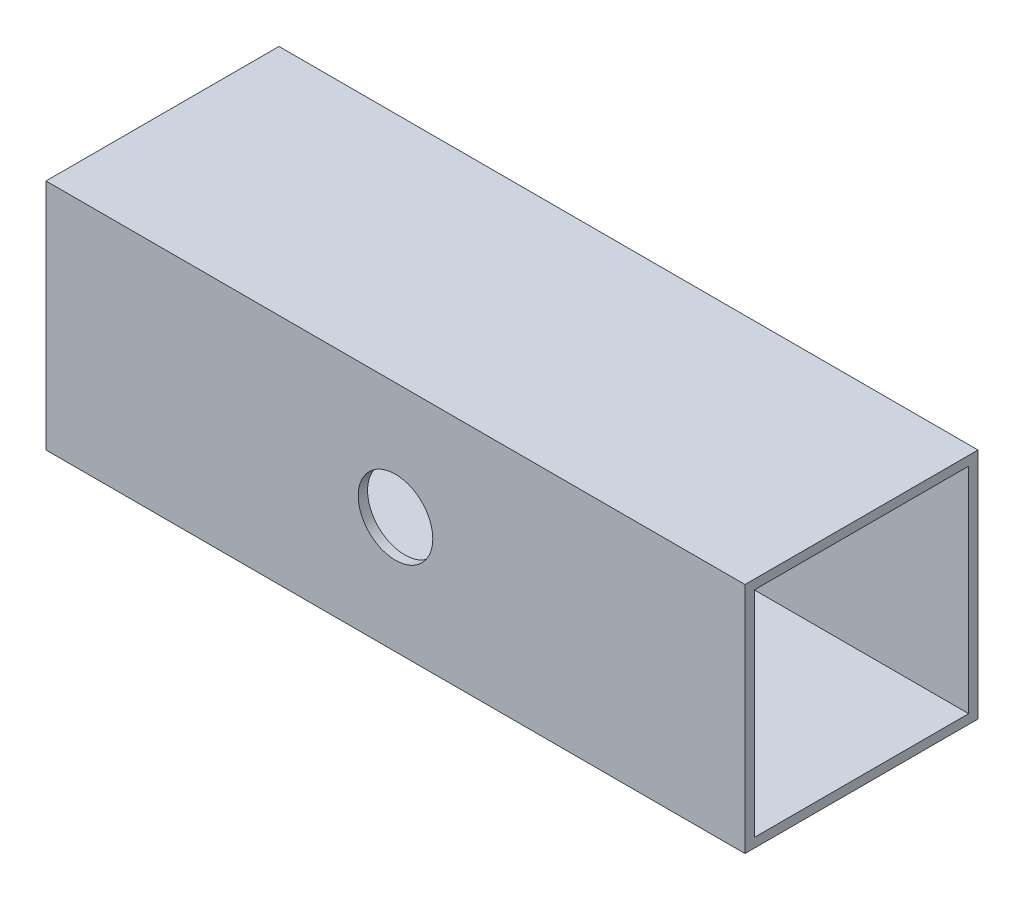
ISO-10303-21;
HEADER;
FILE_DESCRIPTION(('STEP AP214'),'2;1');
FILE_NAME('part.step','',(''),(''),'','','');
FILE_SCHEMA(('AUTOMOTIVE_DESIGN { 1 0 10303 214 1 1 1 1 }'));
ENDSEC;
DATA;
#1=APPLICATION_CONTEXT('core data for automotive mechanical design processes');
#2=APPLICATION_PROTOCOL_DEFINITION('international standard','automotive_design',2000,#1);
#3=PRODUCT_CONTEXT('',#1,'mechanical');
#4=PRODUCT('Part','Part','',(#3));
#5=PRODUCT_RELATED_PRODUCT_CATEGORY('part','',(#4));
#6=PRODUCT_DEFINITION_FORMATION('','',#4);
#7=PRODUCT_DEFINITION_CONTEXT('part definition',#1,'design');
#8=PRODUCT_DEFINITION('design','',#6,#7);
#9=PRODUCT_DEFINITION_SHAPE('','',#8);
#10=(LENGTH_UNIT() NAMED_UNIT(*) SI_UNIT(.MILLI.,.METRE.));
#11=(NAMED_UNIT(*) PLANE_ANGLE_UNIT() SI_UNIT($,.RADIAN.));
#12=(NAMED_UNIT(*) SI_UNIT($,.STERADIAN.) SOLID_ANGLE_UNIT());
#13=UNCERTAINTY_MEASURE_WITH_UNIT(LENGTH_MEASURE(1.E-05),#10,'distance_accuracy_value','');
#14=(GEOMETRIC_REPRESENTATION_CONTEXT(3) GLOBAL_UNCERTAINTY_ASSIGNED_CONTEXT((#13)) GLOBAL_UNIT_ASSIGNED_CONTEXT((#10,
#11,#12)) REPRESENTATION_CONTEXT('',''));
#15=CARTESIAN_POINT('',(0.,0.,0.));
#16=DIRECTION('',(0.,0.,1.));
#17=DIRECTION('',(1.,0.,0.));
#18=AXIS2_PLACEMENT_3D('',#15,#16,#17);
#19=CARTESIAN_POINT('',(75.,0.,0.));
#20=DIRECTION('',(-1.,0.,0.));
#21=DIRECTION('',(0.,0.,1.));
#22=AXIS2_PLACEMENT_3D('',#19,#20,#21);
#23=PLANE('',#22);
#24=DIRECTION('',(0.,1.,0.));
#25=VECTOR('',#24,1.);
#26=CARTESIAN_POINT('',(75.,-12.5,-12.5));
#27=LINE('',#26,#25);
#28=CARTESIAN_POINT('',(75.,-12.5,-12.5));
#29=VERTEX_POINT('',#28);
#30=CARTESIAN_POINT('',(75.,12.5,-12.5));
#31=VERTEX_POINT('',#30);
#32=EDGE_CURVE('E141',#29,#31,#27,.T.);
#33=ORIENTED_EDGE('',*,*,#32,.T.);
#34=DIRECTION('',(0.,0.,1.));
#35=VECTOR('',#34,1.);
#36=CARTESIAN_POINT('',(75.,12.5,12.5));
#37=LINE('',#36,#35);
#38=CARTESIAN_POINT('',(75.,12.5,12.5));
#39=VERTEX_POINT('',#38);
#40=EDGE_CURVE('E144',#31,#39,#37,.T.);
#41=ORIENTED_EDGE('',*,*,#40,.T.);
#42=DIRECTION('',(0.,-1.,0.));
#43=VECTOR('',#42,1.);
#44=CARTESIAN_POINT('',(75.,-12.5,12.5));
#45=LINE('',#44,#43);
#46=CARTESIAN_POINT('',(75.,-12.5,12.5));
#47=VERTEX_POINT('',#46);
#48=EDGE_CURVE('E147',#39,#47,#45,.T.);
#49=ORIENTED_EDGE('',*,*,#48,.T.);
#50=DIRECTION('',(0.,0.,-1.));
#51=VECTOR('',#50,1.);
#52=CARTESIAN_POINT('',(75.,-12.5,12.5));
#53=LINE('',#52,#51);
#54=EDGE_CURVE('E149',#47,#29,#53,.T.);
#55=ORIENTED_EDGE('',*,*,#54,.T.);
#56=EDGE_LOOP('',(#33,#41,#49,#55));
#57=FACE_BOUND('',#56,.T.);
#58=DIRECTION('',(0.,-1.,0.));
#59=VECTOR('',#58,1.);
#60=CARTESIAN_POINT('',(75.,-11.5,11.5));
#61=LINE('',#60,#59);
#62=CARTESIAN_POINT('',(75.,11.5,11.5));
#63=VERTEX_POINT('',#62);
#64=CARTESIAN_POINT('',(75.,-11.5,11.5));
#65=VERTEX_POINT('',#64);
#66=EDGE_CURVE('E103',#63,#65,#61,.T.);
#67=ORIENTED_EDGE('',*,*,#66,.F.);
#68=DIRECTION('',(0.,0.,1.));
#69=VECTOR('',#68,1.);
#70=CARTESIAN_POINT('',(75.,11.5,11.5));
#71=LINE('',#70,#69);
#72=CARTESIAN_POINT('',(75.,11.5,-11.5));
#73=VERTEX_POINT('',#72);
#74=EDGE_CURVE('E125',#73,#63,#71,.T.);
#75=ORIENTED_EDGE('',*,*,#74,.F.);
#76=DIRECTION('',(0.,1.,0.));
#77=VECTOR('',#76,1.);
#78=CARTESIAN_POINT('',(75.,-11.5,-11.5));
#79=LINE('',#78,#77);
#80=CARTESIAN_POINT('',(75.,-11.5,-11.5));
#81=VERTEX_POINT('',#80);
#82=EDGE_CURVE('E123',#81,#73,#79,.T.);
#83=ORIENTED_EDGE('',*,*,#82,.F.);
#84=DIRECTION('',(0.,0.,-1.));
#85=VECTOR('',#84,1.);
#86=CARTESIAN_POINT('',(75.,-11.5,11.5));
#87=LINE('',#86,#85);
#88=EDGE_CURVE('E111',#65,#81,#87,.T.);
#89=ORIENTED_EDGE('',*,*,#88,.F.);
#90=EDGE_LOOP('',(#67,#75,#83,#89));
#91=FACE_BOUND('',#90,.T.);
#92=ADVANCED_FACE('F37',(#57,#91),#23,.F.);
#93=CARTESIAN_POINT('',(0.,0.,0.));
#94=DIRECTION('',(-1.,0.,0.));
#95=DIRECTION('',(0.,0.,1.));
#96=AXIS2_PLACEMENT_3D('',#93,#94,#95);
#97=PLANE('',#96);
#98=DIRECTION('',(0.,1.,0.));
#99=VECTOR('',#98,1.);
#100=CARTESIAN_POINT('',(0.,-12.5,-12.5));
#101=LINE('',#100,#99);
#102=CARTESIAN_POINT('',(0.,-12.5,-12.5));
#103=VERTEX_POINT('',#102);
#104=CARTESIAN_POINT('',(0.,12.5,-12.5));
#105=VERTEX_POINT('',#104);
#106=EDGE_CURVE('E119',#103,#105,#101,.T.);
#107=ORIENTED_EDGE('',*,*,#106,.F.);
#108=DIRECTION('',(0.,0.,-1.));
#109=VECTOR('',#108,1.);
#110=CARTESIAN_POINT('',(0.,-12.5,12.5));
#111=LINE('',#110,#109);
#112=CARTESIAN_POINT('',(0.,-12.5,12.5));
#113=VERTEX_POINT('',#112);
#114=EDGE_CURVE('E145',#113,#103,#111,.T.);
#115=ORIENTED_EDGE('',*,*,#114,.F.);
#116=DIRECTION('',(0.,-1.,0.));
#117=VECTOR('',#116,1.);
#118=CARTESIAN_POINT('',(0.,-12.5,12.5));
#119=LINE('',#118,#117);
#120=CARTESIAN_POINT('',(0.,12.5,12.5));
#121=VERTEX_POINT('',#120);
#122=EDGE_CURVE('E156',#121,#113,#119,.T.);
#123=ORIENTED_EDGE('',*,*,#122,.F.);
#124=DIRECTION('',(0.,0.,1.));
#125=VECTOR('',#124,1.);
#126=CARTESIAN_POINT('',(0.,12.5,12.5));
#127=LINE('',#126,#125);
#128=EDGE_CURVE('E154',#105,#121,#127,.T.);
#129=ORIENTED_EDGE('',*,*,#128,.F.);
#130=EDGE_LOOP('',(#107,#115,#123,#129));
#131=FACE_BOUND('',#130,.T.);
#132=DIRECTION('',(0.,0.,1.));
#133=VECTOR('',#132,1.);
#134=CARTESIAN_POINT('',(0.,11.5,11.5));
#135=LINE('',#134,#133);
#136=CARTESIAN_POINT('',(0.,11.5,-11.5));
#137=VERTEX_POINT('',#136);
#138=CARTESIAN_POINT('',(0.,11.5,11.5));
#139=VERTEX_POINT('',#138);
#140=EDGE_CURVE('E112',#137,#139,#135,.T.);
#141=ORIENTED_EDGE('',*,*,#140,.T.);
#142=DIRECTION('',(0.,-1.,0.));
#143=VECTOR('',#142,1.);
#144=CARTESIAN_POINT('',(0.,-11.5,11.5));
#145=LINE('',#144,#143);
#146=CARTESIAN_POINT('',(0.,-11.5,11.5));
#147=VERTEX_POINT('',#146);
#148=EDGE_CURVE('E61',#139,#147,#145,.T.);
#149=ORIENTED_EDGE('',*,*,#148,.T.);
#150=DIRECTION('',(0.,0.,-1.));
#151=VECTOR('',#150,1.);
#152=CARTESIAN_POINT('',(0.,-11.5,11.5));
#153=LINE('',#152,#151);
#154=CARTESIAN_POINT('',(0.,-11.5,-11.5));
#155=VERTEX_POINT('',#154);
#156=EDGE_CURVE('E118',#147,#155,#153,.T.);
#157=ORIENTED_EDGE('',*,*,#156,.T.);
#158=DIRECTION('',(0.,1.,0.));
#159=VECTOR('',#158,1.);
#160=CARTESIAN_POINT('',(0.,-11.5,-11.5));
#161=LINE('',#160,#159);
#162=EDGE_CURVE('E133',#155,#137,#161,.T.);
#163=ORIENTED_EDGE('',*,*,#162,.T.);
#164=EDGE_LOOP('',(#141,#149,#157,#163));
#165=FACE_BOUND('',#164,.T.);
#166=ADVANCED_FACE('F175',(#131,#165),#97,.T.);
#167=CARTESIAN_POINT('',(75.,-12.5,-12.5));
#168=DIRECTION('',(0.,0.,1.));
#169=DIRECTION('',(1.,0.,0.));
#170=AXIS2_PLACEMENT_3D('',#167,#168,#169);
#171=PLANE('',#170);
#172=CARTESIAN_POINT('',(37.5,0.,-12.5));
#173=DIRECTION('',(0.,0.,1.));
#174=DIRECTION('',(1.,0.,0.));
#175=AXIS2_PLACEMENT_3D('',#172,#173,#174);
#176=CIRCLE('',#175,4.);
#177=CARTESIAN_POINT('',(41.5,0.,-12.5));
#178=VERTEX_POINT('',#177);
#179=EDGE_CURVE('E216',#178,#178,#176,.T.);
#180=ORIENTED_EDGE('',*,*,#179,.T.);
#181=EDGE_LOOP('',(#180));
#182=FACE_BOUND('',#181,.T.);
#183=ORIENTED_EDGE('',*,*,#106,.T.);
#184=DIRECTION('',(-1.,0.,0.));
#185=VECTOR('',#184,1.);
#186=CARTESIAN_POINT('',(75.,12.5,-12.5));
#187=LINE('',#186,#185);
#188=EDGE_CURVE('E11',#31,#105,#187,.T.);
#189=ORIENTED_EDGE('',*,*,#188,.F.);
#190=ORIENTED_EDGE('',*,*,#32,.F.);
#191=DIRECTION('',(-1.,0.,0.));
#192=VECTOR('',#191,1.);
#193=CARTESIAN_POINT('',(75.,-12.5,-12.5));
#194=LINE('',#193,#192);
#195=EDGE_CURVE('E151',#29,#103,#194,.T.);
#196=ORIENTED_EDGE('',*,*,#195,.T.);
#197=EDGE_LOOP('',(#183,#189,#190,#196));
#198=FACE_BOUND('',#197,.T.);
#199=ADVANCED_FACE('F39',(#182,#198),#171,.F.);
#200=CARTESIAN_POINT('',(75.,12.5,12.5));
#201=DIRECTION('',(0.,-1.,0.));
#202=DIRECTION('',(0.,0.,-1.));
#203=AXIS2_PLACEMENT_3D('',#200,#201,#202);
#204=PLANE('',#203);
#205=ORIENTED_EDGE('',*,*,#128,.T.);
#206=DIRECTION('',(-1.,0.,0.));
#207=VECTOR('',#206,1.);
#208=CARTESIAN_POINT('',(75.,12.5,12.5));
#209=LINE('',#208,#207);
#210=EDGE_CURVE('E46',#39,#121,#209,.T.);
#211=ORIENTED_EDGE('',*,*,#210,.F.);
#212=ORIENTED_EDGE('',*,*,#40,.F.);
#213=ORIENTED_EDGE('',*,*,#188,.T.);
#214=EDGE_LOOP('',(#205,#211,#212,#213));
#215=FACE_BOUND('',#214,.T.);
#216=ADVANCED_FACE('F185',(#215),#204,.F.);
#217=CARTESIAN_POINT('',(75.,-12.5,12.5));
#218=DIRECTION('',(0.,0.,-1.));
#219=DIRECTION('',(-1.,0.,0.));
#220=AXIS2_PLACEMENT_3D('',#217,#218,#219);
#221=PLANE('',#220);
#222=CARTESIAN_POINT('',(37.5,0.,12.5));
#223=DIRECTION('',(0.,0.,1.));
#224=DIRECTION('',(1.,0.,0.));
#225=AXIS2_PLACEMENT_3D('',#222,#223,#224);
#226=CIRCLE('',#225,4.);
#227=CARTESIAN_POINT('',(41.5,0.,12.5));
#228=VERTEX_POINT('',#227);
#229=EDGE_CURVE('E218',#228,#228,#226,.T.);
#230=ORIENTED_EDGE('',*,*,#229,.F.);
#231=EDGE_LOOP('',(#230));
#232=FACE_BOUND('',#231,.T.);
#233=ORIENTED_EDGE('',*,*,#122,.T.);
#234=DIRECTION('',(-1.,0.,0.));
#235=VECTOR('',#234,1.);
#236=CARTESIAN_POINT('',(75.,-12.5,12.5));
#237=LINE('',#236,#235);
#238=EDGE_CURVE('E161',#47,#113,#237,.T.);
#239=ORIENTED_EDGE('',*,*,#238,.F.);
#240=ORIENTED_EDGE('',*,*,#48,.F.);
#241=ORIENTED_EDGE('',*,*,#210,.T.);
#242=EDGE_LOOP('',(#233,#239,#240,#241));
#243=FACE_BOUND('',#242,.T.);
#244=ADVANCED_FACE('F169',(#232,#243),#221,.F.);
#245=CARTESIAN_POINT('',(75.,-12.5,12.5));
#246=DIRECTION('',(0.,1.,0.));
#247=DIRECTION('',(0.,0.,1.));
#248=AXIS2_PLACEMENT_3D('',#245,#246,#247);
#249=PLANE('',#248);
#250=ORIENTED_EDGE('',*,*,#114,.T.);
#251=ORIENTED_EDGE('',*,*,#195,.F.);
#252=ORIENTED_EDGE('',*,*,#54,.F.);
#253=ORIENTED_EDGE('',*,*,#238,.T.);
#254=EDGE_LOOP('',(#250,#251,#252,#253));
#255=FACE_BOUND('',#254,.T.);
#256=ADVANCED_FACE('F179',(#255),#249,.F.);
#257=CARTESIAN_POINT('',(75.,-11.5,11.5));
#258=DIRECTION('',(0.,0.,-1.));
#259=DIRECTION('',(-1.,0.,0.));
#260=AXIS2_PLACEMENT_3D('',#257,#258,#259);
#261=PLANE('',#260);
#262=CARTESIAN_POINT('',(37.5,0.,11.5));
#263=DIRECTION('',(0.,0.,-1.));
#264=DIRECTION('',(-1.,0.,0.));
#265=AXIS2_PLACEMENT_3D('',#262,#263,#264);
#266=CIRCLE('',#265,4.);
#267=CARTESIAN_POINT('',(33.5,0.,11.5));
#268=VERTEX_POINT('',#267);
#269=EDGE_CURVE('E131',#268,#268,#266,.T.);
#270=ORIENTED_EDGE('',*,*,#269,.F.);
#271=EDGE_LOOP('',(#270));
#272=FACE_BOUND('',#271,.T.);
#273=ORIENTED_EDGE('',*,*,#148,.F.);
#274=DIRECTION('',(-1.,0.,0.));
#275=VECTOR('',#274,1.);
#276=CARTESIAN_POINT('',(75.,11.5,11.5));
#277=LINE('',#276,#275);
#278=EDGE_CURVE('E107',#63,#139,#277,.T.);
#279=ORIENTED_EDGE('',*,*,#278,.F.);
#280=ORIENTED_EDGE('',*,*,#66,.T.);
#281=DIRECTION('',(-1.,0.,0.));
#282=VECTOR('',#281,1.);
#283=CARTESIAN_POINT('',(75.,-11.5,11.5));
#284=LINE('',#283,#282);
#285=EDGE_CURVE('E106',#65,#147,#284,.T.);
#286=ORIENTED_EDGE('',*,*,#285,.T.);
#287=EDGE_LOOP('',(#273,#279,#280,#286));
#288=FACE_BOUND('',#287,.T.);
#289=ADVANCED_FACE('F105',(#272,#288),#261,.T.);
#290=CARTESIAN_POINT('',(75.,-11.5,11.5));
#291=DIRECTION('',(0.,1.,0.));
#292=DIRECTION('',(0.,0.,1.));
#293=AXIS2_PLACEMENT_3D('',#290,#291,#292);
#294=PLANE('',#293);
#295=ORIENTED_EDGE('',*,*,#156,.F.);
#296=ORIENTED_EDGE('',*,*,#285,.F.);
#297=ORIENTED_EDGE('',*,*,#88,.T.);
#298=DIRECTION('',(-1.,0.,0.));
#299=VECTOR('',#298,1.);
#300=CARTESIAN_POINT('',(75.,-11.5,-11.5));
#301=LINE('',#300,#299);
#302=EDGE_CURVE('E120',#81,#155,#301,.T.);
#303=ORIENTED_EDGE('',*,*,#302,.T.);
#304=EDGE_LOOP('',(#295,#296,#297,#303));
#305=FACE_BOUND('',#304,.T.);
#306=ADVANCED_FACE('F115',(#305),#294,.T.);
#307=CARTESIAN_POINT('',(75.,-11.5,-11.5));
#308=DIRECTION('',(0.,0.,1.));
#309=DIRECTION('',(1.,0.,0.));
#310=AXIS2_PLACEMENT_3D('',#307,#308,#309);
#311=PLANE('',#310);
#312=CARTESIAN_POINT('',(37.5,0.,-11.5));
#313=DIRECTION('',(0.,0.,1.));
#314=DIRECTION('',(1.,0.,0.));
#315=AXIS2_PLACEMENT_3D('',#312,#313,#314);
#316=CIRCLE('',#315,4.);
#317=CARTESIAN_POINT('',(41.5,0.,-11.5));
#318=VERTEX_POINT('',#317);
#319=EDGE_CURVE('E41',#318,#318,#316,.T.);
#320=ORIENTED_EDGE('',*,*,#319,.F.);
#321=EDGE_LOOP('',(#320));
#322=FACE_BOUND('',#321,.T.);
#323=ORIENTED_EDGE('',*,*,#162,.F.);
#324=ORIENTED_EDGE('',*,*,#302,.F.);
#325=ORIENTED_EDGE('',*,*,#82,.T.);
#326=DIRECTION('',(-1.,0.,0.));
#327=VECTOR('',#326,1.);
#328=CARTESIAN_POINT('',(75.,11.5,-11.5));
#329=LINE('',#328,#327);
#330=EDGE_CURVE('E53',#73,#137,#329,.T.);
#331=ORIENTED_EDGE('',*,*,#330,.T.);
#332=EDGE_LOOP('',(#323,#324,#325,#331));
#333=FACE_BOUND('',#332,.T.);
#334=ADVANCED_FACE('F211',(#322,#333),#311,.T.);
#335=CARTESIAN_POINT('',(75.,11.5,11.5));
#336=DIRECTION('',(0.,-1.,0.));
#337=DIRECTION('',(0.,0.,-1.));
#338=AXIS2_PLACEMENT_3D('',#335,#336,#337);
#339=PLANE('',#338);
#340=ORIENTED_EDGE('',*,*,#140,.F.);
#341=ORIENTED_EDGE('',*,*,#330,.F.);
#342=ORIENTED_EDGE('',*,*,#74,.T.);
#343=ORIENTED_EDGE('',*,*,#278,.T.);
#344=EDGE_LOOP('',(#340,#341,#342,#343));
#345=FACE_BOUND('',#344,.T.);
#346=ADVANCED_FACE('F227',(#345),#339,.T.);
#347=CARTESIAN_POINT('',(37.5,0.,-12.5));
#348=DIRECTION('',(0.,0.,1.));
#349=DIRECTION('',(1.,0.,0.));
#350=AXIS2_PLACEMENT_3D('',#347,#348,#349);
#351=CYLINDRICAL_SURFACE('',#350,4.);
#352=ORIENTED_EDGE('',*,*,#319,.T.);
#353=EDGE_LOOP('',(#352));
#354=FACE_BOUND('',#353,.T.);
#355=ORIENTED_EDGE('',*,*,#179,.F.);
#356=EDGE_LOOP('',(#355));
#357=FACE_BOUND('',#356,.T.);
#358=ADVANCED_FACE('F224',(#354,#357),#351,.F.);
#359=ORIENTED_EDGE('',*,*,#269,.T.);
#360=EDGE_LOOP('',(#359));
#361=FACE_BOUND('',#360,.T.);
#362=ORIENTED_EDGE('',*,*,#229,.T.);
#363=EDGE_LOOP('',(#362));
#364=FACE_BOUND('',#363,.T.);
#365=ADVANCED_FACE('F226',(#361,#364),#351,.F.);
#366=CLOSED_SHELL('',(#92,#166,#199,#216,#244,#256,#289,#306,#334,#346,#358,#365));
#367=MANIFOLD_SOLID_BREP('B2',#366);
#368=ADVANCED_BREP_SHAPE_REPRESENTATION('',(#18,#367),#14);
#369=SHAPE_DEFINITION_REPRESENTATION(#9,#368);
ENDSEC;
END-ISO-10303-21;
